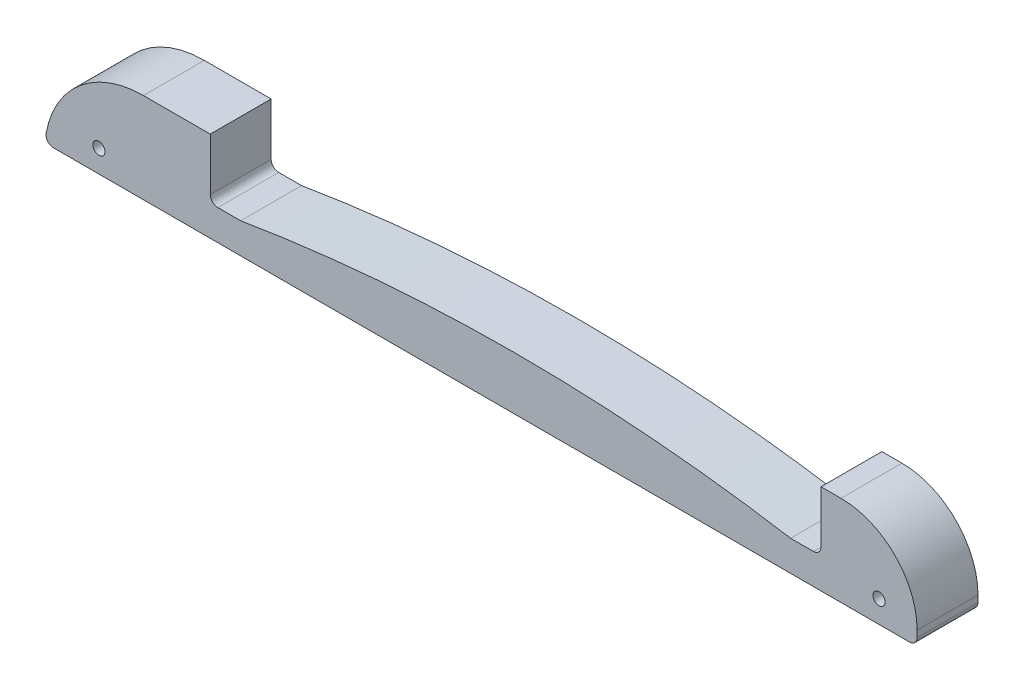
ISO-10303-21;
HEADER;
FILE_DESCRIPTION(('STEP AP214'),'2;1');
FILE_NAME('part.step','',(''),(''),'','','');
FILE_SCHEMA(('AUTOMOTIVE_DESIGN { 1 0 10303 214 1 1 1 1 }'));
ENDSEC;
DATA;
#1=APPLICATION_CONTEXT('core data for automotive mechanical design processes');
#2=APPLICATION_PROTOCOL_DEFINITION('international standard','automotive_design',2000,#1);
#3=PRODUCT_CONTEXT('',#1,'mechanical');
#4=PRODUCT('Part','Part','',(#3));
#5=PRODUCT_RELATED_PRODUCT_CATEGORY('part','',(#4));
#6=PRODUCT_DEFINITION_FORMATION('','',#4);
#7=PRODUCT_DEFINITION_CONTEXT('part definition',#1,'design');
#8=PRODUCT_DEFINITION('design','',#6,#7);
#9=PRODUCT_DEFINITION_SHAPE('','',#8);
#10=(LENGTH_UNIT() NAMED_UNIT(*) SI_UNIT(.MILLI.,.METRE.));
#11=(NAMED_UNIT(*) PLANE_ANGLE_UNIT() SI_UNIT($,.RADIAN.));
#12=(NAMED_UNIT(*) SI_UNIT($,.STERADIAN.) SOLID_ANGLE_UNIT());
#13=UNCERTAINTY_MEASURE_WITH_UNIT(LENGTH_MEASURE(1.E-05),#10,'distance_accuracy_value','');
#14=(GEOMETRIC_REPRESENTATION_CONTEXT(3) GLOBAL_UNCERTAINTY_ASSIGNED_CONTEXT((#13)) GLOBAL_UNIT_ASSIGNED_CONTEXT((#10,
#11,#12)) REPRESENTATION_CONTEXT('',''));
#15=CARTESIAN_POINT('',(0.,0.,0.));
#16=DIRECTION('',(0.,0.,1.));
#17=DIRECTION('',(1.,0.,0.));
#18=AXIS2_PLACEMENT_3D('',#15,#16,#17);
#19=CARTESIAN_POINT('',(7.24999999999997,-213.013788444421,0.));
#20=DIRECTION('',(0.,0.,-1.));
#21=DIRECTION('',(-1.,0.,0.));
#22=AXIS2_PLACEMENT_3D('',#19,#20,#21);
#23=PLANE('',#22);
#24=CARTESIAN_POINT('',(55.,2.93,0.));
#25=DIRECTION('',(0.,0.,1.));
#26=DIRECTION('',(1.,0.,0.));
#27=AXIS2_PLACEMENT_3D('',#24,#25,#26);
#28=CIRCLE('',#27,0.800000000000002);
#29=CARTESIAN_POINT('',(55.8,2.93,0.));
#30=VERTEX_POINT('',#29);
#31=EDGE_CURVE('E509',#30,#30,#28,.T.);
#32=ORIENTED_EDGE('',*,*,#31,.F.);
#33=EDGE_LOOP('',(#32));
#34=FACE_BOUND('',#33,.T.);
#35=DIRECTION('',(1.,0.,0.));
#36=VECTOR('',#35,1.);
#37=CARTESIAN_POINT('',(-54.6,0.,0.));
#38=LINE('',#37,#36);
#39=CARTESIAN_POINT('',(-53.4577226748116,0.,0.));
#40=VERTEX_POINT('',#39);
#41=CARTESIAN_POINT('',(59.,0.,0.));
#42=VERTEX_POINT('',#41);
#43=EDGE_CURVE('E233',#40,#42,#38,.T.);
#44=ORIENTED_EDGE('',*,*,#43,.T.);
#45=CARTESIAN_POINT('',(59.,1.,0.));
#46=DIRECTION('',(0.,0.,-1.));
#47=DIRECTION('',(-1.,0.,0.));
#48=AXIS2_PLACEMENT_3D('',#45,#46,#47);
#49=CIRCLE('',#48,1.);
#50=CARTESIAN_POINT('',(60.,1.,0.));
#51=VERTEX_POINT('',#50);
#52=EDGE_CURVE('E273',#42,#51,#49,.F.);
#53=ORIENTED_EDGE('',*,*,#52,.T.);
#54=DIRECTION('',(0.,1.,0.));
#55=VECTOR('',#54,1.);
#56=CARTESIAN_POINT('',(60.,11.86,0.));
#57=LINE('',#56,#55);
#58=CARTESIAN_POINT('',(60.,1.86,0.));
#59=VERTEX_POINT('',#58);
#60=EDGE_CURVE('E202',#51,#59,#57,.T.);
#61=ORIENTED_EDGE('',*,*,#60,.T.);
#62=CARTESIAN_POINT('',(50.,1.86,0.));
#63=DIRECTION('',(0.,0.,-1.));
#64=DIRECTION('',(-1.,0.,0.));
#65=AXIS2_PLACEMENT_3D('',#62,#63,#64);
#66=CIRCLE('',#65,10.);
#67=CARTESIAN_POINT('',(50.,11.86,0.));
#68=VERTEX_POINT('',#67);
#69=EDGE_CURVE('E255',#59,#68,#66,.F.);
#70=ORIENTED_EDGE('',*,*,#69,.T.);
#71=DIRECTION('',(-1.,0.,0.));
#72=VECTOR('',#71,1.);
#73=CARTESIAN_POINT('',(60.,11.86,0.));
#74=LINE('',#73,#72);
#75=CARTESIAN_POINT('',(47.3749999999999,11.86,0.));
#76=VERTEX_POINT('',#75);
#77=EDGE_CURVE('E205',#68,#76,#74,.T.);
#78=ORIENTED_EDGE('',*,*,#77,.T.);
#79=DIRECTION('',(0.,-1.,0.));
#80=VECTOR('',#79,1.);
#81=CARTESIAN_POINT('',(47.3749999999999,11.86,0.));
#82=LINE('',#81,#80);
#83=CARTESIAN_POINT('',(47.3749999999999,5.,0.));
#84=VERTEX_POINT('',#83);
#85=EDGE_CURVE('E169',#76,#84,#82,.T.);
#86=ORIENTED_EDGE('',*,*,#85,.T.);
#87=CARTESIAN_POINT('',(46.3749999999999,5.,0.));
#88=DIRECTION('',(0.,0.,-1.));
#89=DIRECTION('',(-1.,0.,0.));
#90=AXIS2_PLACEMENT_3D('',#87,#88,#89);
#91=CIRCLE('',#90,1.);
#92=CARTESIAN_POINT('',(46.3749999999999,4.,0.));
#93=VERTEX_POINT('',#92);
#94=EDGE_CURVE('E301',#84,#93,#91,.T.);
#95=ORIENTED_EDGE('',*,*,#94,.T.);
#96=DIRECTION('',(-1.,0.,0.));
#97=VECTOR('',#96,1.);
#98=CARTESIAN_POINT('',(47.3749999999999,4.,0.));
#99=LINE('',#98,#97);
#100=CARTESIAN_POINT('',(43.3749999999999,4.,0.));
#101=VERTEX_POINT('',#100);
#102=EDGE_CURVE('E211',#93,#101,#99,.T.);
#103=ORIENTED_EDGE('',*,*,#102,.T.);
#104=CARTESIAN_POINT('',(7.24999999999997,-213.013788444421,0.));
#105=DIRECTION('',(0.,0.,1.));
#106=DIRECTION('',(-1.,0.,0.));
#107=AXIS2_PLACEMENT_3D('',#104,#105,#106);
#108=CIRCLE('',#107,220.);
#109=CARTESIAN_POINT('',(-28.8750000000001,3.99999999999998,0.));
#110=VERTEX_POINT('',#109);
#111=EDGE_CURVE('E214',#101,#110,#108,.T.);
#112=ORIENTED_EDGE('',*,*,#111,.T.);
#113=DIRECTION('',(-1.,0.,0.));
#114=VECTOR('',#113,1.);
#115=CARTESIAN_POINT('',(-32.8750000000001,3.99999999999998,0.));
#116=LINE('',#115,#114);
#117=CARTESIAN_POINT('',(-31.8750000000001,3.99999999999998,0.));
#118=VERTEX_POINT('',#117);
#119=EDGE_CURVE('E218',#110,#118,#116,.T.);
#120=ORIENTED_EDGE('',*,*,#119,.T.);
#121=CARTESIAN_POINT('',(-31.8750000000001,4.99999999999998,0.));
#122=DIRECTION('',(0.,0.,-1.));
#123=DIRECTION('',(-1.,0.,0.));
#124=AXIS2_PLACEMENT_3D('',#121,#122,#123);
#125=CIRCLE('',#124,1.);
#126=CARTESIAN_POINT('',(-32.8750000000001,4.99999999999998,0.));
#127=VERTEX_POINT('',#126);
#128=EDGE_CURVE('E50',#118,#127,#125,.T.);
#129=ORIENTED_EDGE('',*,*,#128,.T.);
#130=DIRECTION('',(0.,1.,0.));
#131=VECTOR('',#130,1.);
#132=CARTESIAN_POINT('',(-32.8750000000001,3.99999999999998,0.));
#133=LINE('',#132,#131);
#134=CARTESIAN_POINT('',(-32.8750000000001,11.86,0.));
#135=VERTEX_POINT('',#134);
#136=EDGE_CURVE('E222',#127,#135,#133,.T.);
#137=ORIENTED_EDGE('',*,*,#136,.T.);
#138=DIRECTION('',(-1.,0.,0.));
#139=VECTOR('',#138,1.);
#140=CARTESIAN_POINT('',(-41.6500810813349,11.86,0.));
#141=LINE('',#140,#139);
#142=CARTESIAN_POINT('',(-41.6500810813349,11.86,0.));
#143=VERTEX_POINT('',#142);
#144=EDGE_CURVE('E225',#135,#143,#141,.T.);
#145=ORIENTED_EDGE('',*,*,#144,.T.);
#146=CARTESIAN_POINT('',(-41.6500810813349,-1.14,0.));
#147=DIRECTION('',(0.,0.,1.));
#148=DIRECTION('',(1.,0.,0.));
#149=AXIS2_PLACEMENT_3D('',#146,#147,#148);
#150=CIRCLE('',#149,13.);
#151=CARTESIAN_POINT('',(-54.4416928076013,1.17833333333333,0.));
#152=VERTEX_POINT('',#151);
#153=EDGE_CURVE('E229',#143,#152,#150,.T.);
#154=ORIENTED_EDGE('',*,*,#153,.T.);
#155=CARTESIAN_POINT('',(-53.4577226748116,1.,0.));
#156=DIRECTION('',(0.,0.,-1.));
#157=DIRECTION('',(-1.,0.,0.));
#158=AXIS2_PLACEMENT_3D('',#155,#156,#157);
#159=CIRCLE('',#158,1.);
#160=EDGE_CURVE('E270',#152,#40,#159,.F.);
#161=ORIENTED_EDGE('',*,*,#160,.T.);
#162=EDGE_LOOP('',(#44,#53,#61,#70,#78,#86,#95,#103,#112,#120,#129,#137,#145,#154,#161));
#163=FACE_BOUND('',#162,.T.);
#164=CARTESIAN_POINT('',(-47.5,2.93,0.));
#165=DIRECTION('',(0.,0.,1.));
#166=DIRECTION('',(1.,0.,0.));
#167=AXIS2_PLACEMENT_3D('',#164,#165,#166);
#168=CIRCLE('',#167,0.800000000000002);
#169=CARTESIAN_POINT('',(-46.7,2.93,0.));
#170=VERTEX_POINT('',#169);
#171=EDGE_CURVE('E505',#170,#170,#168,.T.);
#172=ORIENTED_EDGE('',*,*,#171,.F.);
#173=EDGE_LOOP('',(#172));
#174=FACE_BOUND('',#173,.T.);
#175=ADVANCED_FACE('F41',(#34,#163,#174),#23,.F.);
#176=CARTESIAN_POINT('',(7.24999999999997,-213.013788444421,-8.));
#177=DIRECTION('',(0.,0.,-1.));
#178=DIRECTION('',(-1.,0.,0.));
#179=AXIS2_PLACEMENT_3D('',#176,#177,#178);
#180=PLANE('',#179);
#181=CARTESIAN_POINT('',(55.,2.93,-8.));
#182=DIRECTION('',(0.,0.,1.));
#183=DIRECTION('',(1.,0.,0.));
#184=AXIS2_PLACEMENT_3D('',#181,#182,#183);
#185=CIRCLE('',#184,0.799999999999995);
#186=CARTESIAN_POINT('',(55.8,2.93,-8.));
#187=VERTEX_POINT('',#186);
#188=EDGE_CURVE('E206',#187,#187,#185,.T.);
#189=ORIENTED_EDGE('',*,*,#188,.T.);
#190=EDGE_LOOP('',(#189));
#191=FACE_BOUND('',#190,.T.);
#192=DIRECTION('',(0.,1.,0.));
#193=VECTOR('',#192,1.);
#194=CARTESIAN_POINT('',(60.,11.86,-8.));
#195=LINE('',#194,#193);
#196=CARTESIAN_POINT('',(60.,1.,-8.));
#197=VERTEX_POINT('',#196);
#198=CARTESIAN_POINT('',(60.,1.86,-8.));
#199=VERTEX_POINT('',#198);
#200=EDGE_CURVE('E162',#197,#199,#195,.T.);
#201=ORIENTED_EDGE('',*,*,#200,.F.);
#202=CARTESIAN_POINT('',(59.,1.,-8.));
#203=DIRECTION('',(0.,0.,-1.));
#204=DIRECTION('',(-1.,0.,0.));
#205=AXIS2_PLACEMENT_3D('',#202,#203,#204);
#206=CIRCLE('',#205,1.);
#207=CARTESIAN_POINT('',(59.,0.,-8.));
#208=VERTEX_POINT('',#207);
#209=EDGE_CURVE('E282',#197,#208,#206,.T.);
#210=ORIENTED_EDGE('',*,*,#209,.T.);
#211=DIRECTION('',(1.,0.,0.));
#212=VECTOR('',#211,1.);
#213=CARTESIAN_POINT('',(0.,0.,-8.));
#214=LINE('',#213,#212);
#215=CARTESIAN_POINT('',(-53.4577226748116,0.,-8.));
#216=VERTEX_POINT('',#215);
#217=EDGE_CURVE('E237',#216,#208,#214,.T.);
#218=ORIENTED_EDGE('',*,*,#217,.F.);
#219=CARTESIAN_POINT('',(-53.4577226748116,1.,-8.));
#220=DIRECTION('',(0.,0.,-1.));
#221=DIRECTION('',(-1.,0.,0.));
#222=AXIS2_PLACEMENT_3D('',#219,#220,#221);
#223=CIRCLE('',#222,1.);
#224=CARTESIAN_POINT('',(-54.4416928076013,1.17833333333333,-8.));
#225=VERTEX_POINT('',#224);
#226=EDGE_CURVE('E279',#216,#225,#223,.T.);
#227=ORIENTED_EDGE('',*,*,#226,.T.);
#228=CARTESIAN_POINT('',(-41.6500810813349,-1.14,-8.));
#229=DIRECTION('',(0.,0.,1.));
#230=DIRECTION('',(1.,0.,0.));
#231=AXIS2_PLACEMENT_3D('',#228,#229,#230);
#232=CIRCLE('',#231,13.);
#233=CARTESIAN_POINT('',(-41.6500810813349,11.86,-8.));
#234=VERTEX_POINT('',#233);
#235=EDGE_CURVE('E172',#234,#225,#232,.T.);
#236=ORIENTED_EDGE('',*,*,#235,.F.);
#237=DIRECTION('',(-1.,0.,0.));
#238=VECTOR('',#237,1.);
#239=CARTESIAN_POINT('',(-41.6500810813349,11.86,-8.));
#240=LINE('',#239,#238);
#241=CARTESIAN_POINT('',(-32.8750000000001,11.86,-8.));
#242=VERTEX_POINT('',#241);
#243=EDGE_CURVE('E195',#242,#234,#240,.T.);
#244=ORIENTED_EDGE('',*,*,#243,.F.);
#245=DIRECTION('',(0.,1.,0.));
#246=VECTOR('',#245,1.);
#247=CARTESIAN_POINT('',(-32.8750000000001,3.99999999999998,-8.));
#248=LINE('',#247,#246);
#249=CARTESIAN_POINT('',(-32.8750000000001,4.99999999999998,-8.));
#250=VERTEX_POINT('',#249);
#251=EDGE_CURVE('E192',#250,#242,#248,.T.);
#252=ORIENTED_EDGE('',*,*,#251,.F.);
#253=CARTESIAN_POINT('',(-31.8750000000001,4.99999999999998,-8.));
#254=DIRECTION('',(0.,0.,-1.));
#255=DIRECTION('',(-1.,0.,0.));
#256=AXIS2_PLACEMENT_3D('',#253,#254,#255);
#257=CIRCLE('',#256,1.);
#258=CARTESIAN_POINT('',(-31.8750000000001,3.99999999999998,-8.));
#259=VERTEX_POINT('',#258);
#260=EDGE_CURVE('E11',#250,#259,#257,.F.);
#261=ORIENTED_EDGE('',*,*,#260,.T.);
#262=DIRECTION('',(-1.,0.,0.));
#263=VECTOR('',#262,1.);
#264=CARTESIAN_POINT('',(-32.8750000000001,3.99999999999998,-8.));
#265=LINE('',#264,#263);
#266=CARTESIAN_POINT('',(-28.8750000000001,3.99999999999998,-8.));
#267=VERTEX_POINT('',#266);
#268=EDGE_CURVE('E188',#267,#259,#265,.T.);
#269=ORIENTED_EDGE('',*,*,#268,.F.);
#270=CARTESIAN_POINT('',(7.24999999999997,-213.013788444421,-8.));
#271=DIRECTION('',(0.,0.,1.));
#272=DIRECTION('',(-1.,0.,0.));
#273=AXIS2_PLACEMENT_3D('',#270,#271,#272);
#274=CIRCLE('',#273,220.);
#275=CARTESIAN_POINT('',(43.3749999999999,4.,-8.));
#276=VERTEX_POINT('',#275);
#277=EDGE_CURVE('E181',#276,#267,#274,.T.);
#278=ORIENTED_EDGE('',*,*,#277,.F.);
#279=DIRECTION('',(-1.,0.,0.));
#280=VECTOR('',#279,1.);
#281=CARTESIAN_POINT('',(47.3749999999999,4.,-8.));
#282=LINE('',#281,#280);
#283=CARTESIAN_POINT('',(46.3749999999999,4.,-8.));
#284=VERTEX_POINT('',#283);
#285=EDGE_CURVE('E178',#284,#276,#282,.T.);
#286=ORIENTED_EDGE('',*,*,#285,.F.);
#287=CARTESIAN_POINT('',(46.3749999999999,5.,-8.));
#288=DIRECTION('',(0.,0.,-1.));
#289=DIRECTION('',(-1.,0.,0.));
#290=AXIS2_PLACEMENT_3D('',#287,#288,#289);
#291=CIRCLE('',#290,1.);
#292=CARTESIAN_POINT('',(47.3749999999999,5.,-8.));
#293=VERTEX_POINT('',#292);
#294=EDGE_CURVE('E57',#284,#293,#291,.F.);
#295=ORIENTED_EDGE('',*,*,#294,.T.);
#296=DIRECTION('',(0.,-1.,0.));
#297=VECTOR('',#296,1.);
#298=CARTESIAN_POINT('',(47.3749999999999,11.86,-8.));
#299=LINE('',#298,#297);
#300=CARTESIAN_POINT('',(47.3749999999999,11.86,-8.));
#301=VERTEX_POINT('',#300);
#302=EDGE_CURVE('E161',#301,#293,#299,.T.);
#303=ORIENTED_EDGE('',*,*,#302,.F.);
#304=DIRECTION('',(-1.,0.,0.));
#305=VECTOR('',#304,1.);
#306=CARTESIAN_POINT('',(60.,11.86,-8.));
#307=LINE('',#306,#305);
#308=CARTESIAN_POINT('',(50.,11.86,-8.));
#309=VERTEX_POINT('',#308);
#310=EDGE_CURVE('E150',#309,#301,#307,.T.);
#311=ORIENTED_EDGE('',*,*,#310,.F.);
#312=CARTESIAN_POINT('',(50.,1.86,-8.));
#313=DIRECTION('',(0.,0.,-1.));
#314=DIRECTION('',(-1.,0.,0.));
#315=AXIS2_PLACEMENT_3D('',#312,#313,#314);
#316=CIRCLE('',#315,10.);
#317=EDGE_CURVE('E260',#309,#199,#316,.T.);
#318=ORIENTED_EDGE('',*,*,#317,.T.);
#319=EDGE_LOOP('',(#201,#210,#218,#227,#236,#244,#252,#261,#269,#278,#286,#295,#303,#311,#318));
#320=FACE_BOUND('',#319,.T.);
#321=CARTESIAN_POINT('',(-47.5,2.93,-8.));
#322=DIRECTION('',(0.,0.,1.));
#323=DIRECTION('',(1.,0.,0.));
#324=AXIS2_PLACEMENT_3D('',#321,#322,#323);
#325=CIRCLE('',#324,0.799999999999995);
#326=CARTESIAN_POINT('',(-46.7,2.93,-8.));
#327=VERTEX_POINT('',#326);
#328=EDGE_CURVE('E502',#327,#327,#325,.T.);
#329=ORIENTED_EDGE('',*,*,#328,.T.);
#330=EDGE_LOOP('',(#329));
#331=FACE_BOUND('',#330,.T.);
#332=ADVANCED_FACE('F175',(#191,#320,#331),#180,.T.);
#333=CARTESIAN_POINT('',(-54.6,0.,-8.));
#334=DIRECTION('',(0.,-1.,0.));
#335=DIRECTION('',(0.,0.,-1.));
#336=AXIS2_PLACEMENT_3D('',#333,#334,#335);
#337=PLANE('',#336);
#338=ORIENTED_EDGE('',*,*,#217,.T.);
#339=DIRECTION('',(0.,0.,1.));
#340=VECTOR('',#339,1.);
#341=CARTESIAN_POINT('',(59.,0.,-8.));
#342=LINE('',#341,#340);
#343=EDGE_CURVE('E266',#208,#42,#342,.T.);
#344=ORIENTED_EDGE('',*,*,#343,.T.);
#345=ORIENTED_EDGE('',*,*,#43,.F.);
#346=DIRECTION('',(0.,0.,1.));
#347=VECTOR('',#346,1.);
#348=CARTESIAN_POINT('',(-53.4577226748116,0.,-8.));
#349=LINE('',#348,#347);
#350=EDGE_CURVE('E263',#40,#216,#349,.F.);
#351=ORIENTED_EDGE('',*,*,#350,.T.);
#352=EDGE_LOOP('',(#338,#344,#345,#351));
#353=FACE_BOUND('',#352,.T.);
#354=ADVANCED_FACE('F345',(#353),#337,.T.);
#355=CARTESIAN_POINT('',(-41.6500810813349,-1.14,-8.));
#356=DIRECTION('',(0.,0.,1.));
#357=DIRECTION('',(1.,0.,0.));
#358=AXIS2_PLACEMENT_3D('',#355,#356,#357);
#359=CYLINDRICAL_SURFACE('',#358,13.);
#360=ORIENTED_EDGE('',*,*,#235,.T.);
#361=DIRECTION('',(0.,0.,1.));
#362=VECTOR('',#361,1.);
#363=CARTESIAN_POINT('',(-54.4416928076013,1.17833333333333,-8.));
#364=LINE('',#363,#362);
#365=EDGE_CURVE('E285',#225,#152,#364,.T.);
#366=ORIENTED_EDGE('',*,*,#365,.T.);
#367=ORIENTED_EDGE('',*,*,#153,.F.);
#368=DIRECTION('',(0.,0.,1.));
#369=VECTOR('',#368,1.);
#370=CARTESIAN_POINT('',(-41.6500810813349,11.86,-8.));
#371=LINE('',#370,#369);
#372=EDGE_CURVE('E238',#234,#143,#371,.T.);
#373=ORIENTED_EDGE('',*,*,#372,.F.);
#374=EDGE_LOOP('',(#360,#366,#367,#373));
#375=FACE_BOUND('',#374,.T.);
#376=ADVANCED_FACE('F354',(#375),#359,.T.);
#377=CARTESIAN_POINT('',(-41.6500810813349,11.86,-8.));
#378=DIRECTION('',(0.,1.,0.));
#379=DIRECTION('',(0.,0.,1.));
#380=AXIS2_PLACEMENT_3D('',#377,#378,#379);
#381=PLANE('',#380);
#382=ORIENTED_EDGE('',*,*,#144,.F.);
#383=DIRECTION('',(0.,0.,1.));
#384=VECTOR('',#383,1.);
#385=CARTESIAN_POINT('',(-32.8750000000001,11.86,-8.));
#386=LINE('',#385,#384);
#387=EDGE_CURVE('E242',#242,#135,#386,.T.);
#388=ORIENTED_EDGE('',*,*,#387,.F.);
#389=ORIENTED_EDGE('',*,*,#243,.T.);
#390=ORIENTED_EDGE('',*,*,#372,.T.);
#391=EDGE_LOOP('',(#382,#388,#389,#390));
#392=FACE_BOUND('',#391,.T.);
#393=ADVANCED_FACE('F357',(#392),#381,.T.);
#394=CARTESIAN_POINT('',(-32.8750000000001,3.99999999999998,-8.));
#395=DIRECTION('',(1.,0.,0.));
#396=DIRECTION('',(0.,0.,-1.));
#397=AXIS2_PLACEMENT_3D('',#394,#395,#396);
#398=PLANE('',#397);
#399=ORIENTED_EDGE('',*,*,#136,.F.);
#400=DIRECTION('',(0.,0.,1.));
#401=VECTOR('',#400,1.);
#402=CARTESIAN_POINT('',(-32.8750000000001,4.99999999999998,-8.));
#403=LINE('',#402,#401);
#404=EDGE_CURVE('E298',#127,#250,#403,.F.);
#405=ORIENTED_EDGE('',*,*,#404,.T.);
#406=ORIENTED_EDGE('',*,*,#251,.T.);
#407=ORIENTED_EDGE('',*,*,#387,.T.);
#408=EDGE_LOOP('',(#399,#405,#406,#407));
#409=FACE_BOUND('',#408,.T.);
#410=ADVANCED_FACE('F314',(#409),#398,.T.);
#411=CARTESIAN_POINT('',(-32.8750000000001,3.99999999999998,-8.));
#412=DIRECTION('',(0.,1.,0.));
#413=DIRECTION('',(-1.,0.,0.));
#414=AXIS2_PLACEMENT_3D('',#411,#412,#413);
#415=PLANE('',#414);
#416=ORIENTED_EDGE('',*,*,#268,.T.);
#417=DIRECTION('',(0.,0.,1.));
#418=VECTOR('',#417,1.);
#419=CARTESIAN_POINT('',(-31.8750000000001,3.99999999999998,0.));
#420=LINE('',#419,#418);
#421=EDGE_CURVE('E294',#259,#118,#420,.T.);
#422=ORIENTED_EDGE('',*,*,#421,.T.);
#423=ORIENTED_EDGE('',*,*,#119,.F.);
#424=DIRECTION('',(0.,0.,1.));
#425=VECTOR('',#424,1.);
#426=CARTESIAN_POINT('',(-28.8750000000001,3.99999999999998,-8.));
#427=LINE('',#426,#425);
#428=EDGE_CURVE('E246',#267,#110,#427,.T.);
#429=ORIENTED_EDGE('',*,*,#428,.F.);
#430=EDGE_LOOP('',(#416,#422,#423,#429));
#431=FACE_BOUND('',#430,.T.);
#432=ADVANCED_FACE('F323',(#431),#415,.T.);
#433=CARTESIAN_POINT('',(7.24999999999997,-213.013788444421,-8.));
#434=DIRECTION('',(0.,0.,1.));
#435=DIRECTION('',(1.,0.,0.));
#436=AXIS2_PLACEMENT_3D('',#433,#434,#435);
#437=CYLINDRICAL_SURFACE('',#436,220.);
#438=ORIENTED_EDGE('',*,*,#111,.F.);
#439=DIRECTION('',(0.,0.,1.));
#440=VECTOR('',#439,1.);
#441=CARTESIAN_POINT('',(43.3749999999999,4.,-8.));
#442=LINE('',#441,#440);
#443=EDGE_CURVE('E171',#276,#101,#442,.T.);
#444=ORIENTED_EDGE('',*,*,#443,.F.);
#445=ORIENTED_EDGE('',*,*,#277,.T.);
#446=ORIENTED_EDGE('',*,*,#428,.T.);
#447=EDGE_LOOP('',(#438,#444,#445,#446));
#448=FACE_BOUND('',#447,.T.);
#449=ADVANCED_FACE('F326',(#448),#437,.T.);
#450=CARTESIAN_POINT('',(47.3749999999999,4.,-8.));
#451=DIRECTION('',(0.,1.,0.));
#452=DIRECTION('',(0.,0.,1.));
#453=AXIS2_PLACEMENT_3D('',#450,#451,#452);
#454=PLANE('',#453);
#455=ORIENTED_EDGE('',*,*,#102,.F.);
#456=DIRECTION('',(0.,0.,1.));
#457=VECTOR('',#456,1.);
#458=CARTESIAN_POINT('',(46.3749999999999,4.,-8.));
#459=LINE('',#458,#457);
#460=EDGE_CURVE('E65',#93,#284,#459,.F.);
#461=ORIENTED_EDGE('',*,*,#460,.T.);
#462=ORIENTED_EDGE('',*,*,#285,.T.);
#463=ORIENTED_EDGE('',*,*,#443,.T.);
#464=EDGE_LOOP('',(#455,#461,#462,#463));
#465=FACE_BOUND('',#464,.T.);
#466=ADVANCED_FACE('F409',(#465),#454,.T.);
#467=CARTESIAN_POINT('',(47.3749999999999,11.86,-8.));
#468=DIRECTION('',(-1.,0.,0.));
#469=DIRECTION('',(0.,-1.,0.));
#470=AXIS2_PLACEMENT_3D('',#467,#468,#469);
#471=PLANE('',#470);
#472=ORIENTED_EDGE('',*,*,#302,.T.);
#473=DIRECTION('',(0.,0.,1.));
#474=VECTOR('',#473,1.);
#475=CARTESIAN_POINT('',(47.3749999999999,5.,0.));
#476=LINE('',#475,#474);
#477=EDGE_CURVE('E289',#293,#84,#476,.T.);
#478=ORIENTED_EDGE('',*,*,#477,.T.);
#479=ORIENTED_EDGE('',*,*,#85,.F.);
#480=DIRECTION('',(0.,0.,1.));
#481=VECTOR('',#480,1.);
#482=CARTESIAN_POINT('',(47.3749999999999,11.86,-8.));
#483=LINE('',#482,#481);
#484=EDGE_CURVE('E154',#301,#76,#483,.T.);
#485=ORIENTED_EDGE('',*,*,#484,.F.);
#486=EDGE_LOOP('',(#472,#478,#479,#485));
#487=FACE_BOUND('',#486,.T.);
#488=ADVANCED_FACE('F165',(#487),#471,.T.);
#489=CARTESIAN_POINT('',(60.,11.86,-8.));
#490=DIRECTION('',(0.,1.,0.));
#491=DIRECTION('',(-1.,0.,0.));
#492=AXIS2_PLACEMENT_3D('',#489,#490,#491);
#493=PLANE('',#492);
#494=ORIENTED_EDGE('',*,*,#77,.F.);
#495=DIRECTION('',(0.,0.,1.));
#496=VECTOR('',#495,1.);
#497=CARTESIAN_POINT('',(50.,11.86,-8.));
#498=LINE('',#497,#496);
#499=EDGE_CURVE('E157',#68,#309,#498,.F.);
#500=ORIENTED_EDGE('',*,*,#499,.T.);
#501=ORIENTED_EDGE('',*,*,#310,.T.);
#502=ORIENTED_EDGE('',*,*,#484,.T.);
#503=EDGE_LOOP('',(#494,#500,#501,#502));
#504=FACE_BOUND('',#503,.T.);
#505=ADVANCED_FACE('F153',(#504),#493,.T.);
#506=CARTESIAN_POINT('',(60.,11.86,-8.));
#507=DIRECTION('',(1.,0.,0.));
#508=DIRECTION('',(0.,0.,-1.));
#509=AXIS2_PLACEMENT_3D('',#506,#507,#508);
#510=PLANE('',#509);
#511=ORIENTED_EDGE('',*,*,#60,.F.);
#512=DIRECTION('',(0.,0.,1.));
#513=VECTOR('',#512,1.);
#514=CARTESIAN_POINT('',(60.,1.,-8.));
#515=LINE('',#514,#513);
#516=EDGE_CURVE('E276',#51,#197,#515,.F.);
#517=ORIENTED_EDGE('',*,*,#516,.T.);
#518=ORIENTED_EDGE('',*,*,#200,.T.);
#519=DIRECTION('',(0.,0.,1.));
#520=VECTOR('',#519,1.);
#521=CARTESIAN_POINT('',(60.,1.86,-8.));
#522=LINE('',#521,#520);
#523=EDGE_CURVE('E241',#199,#59,#522,.T.);
#524=ORIENTED_EDGE('',*,*,#523,.T.);
#525=EDGE_LOOP('',(#511,#517,#518,#524));
#526=FACE_BOUND('',#525,.T.);
#527=ADVANCED_FACE('F428',(#526),#510,.T.);
#528=CARTESIAN_POINT('',(50.,1.86,-8.));
#529=DIRECTION('',(0.,0.,1.));
#530=DIRECTION('',(1.,0.,0.));
#531=AXIS2_PLACEMENT_3D('',#528,#529,#530);
#532=CYLINDRICAL_SURFACE('',#531,10.);
#533=ORIENTED_EDGE('',*,*,#317,.F.);
#534=ORIENTED_EDGE('',*,*,#499,.F.);
#535=ORIENTED_EDGE('',*,*,#69,.F.);
#536=ORIENTED_EDGE('',*,*,#523,.F.);
#537=EDGE_LOOP('',(#533,#534,#535,#536));
#538=FACE_BOUND('',#537,.T.);
#539=ADVANCED_FACE('F332',(#538),#532,.T.);
#540=CARTESIAN_POINT('',(59.,1.,-8.));
#541=DIRECTION('',(0.,0.,1.));
#542=DIRECTION('',(1.,0.,0.));
#543=AXIS2_PLACEMENT_3D('',#540,#541,#542);
#544=CYLINDRICAL_SURFACE('',#543,1.);
#545=ORIENTED_EDGE('',*,*,#209,.F.);
#546=ORIENTED_EDGE('',*,*,#516,.F.);
#547=ORIENTED_EDGE('',*,*,#52,.F.);
#548=ORIENTED_EDGE('',*,*,#343,.F.);
#549=EDGE_LOOP('',(#545,#546,#547,#548));
#550=FACE_BOUND('',#549,.T.);
#551=ADVANCED_FACE('F342',(#550),#544,.T.);
#552=CARTESIAN_POINT('',(-53.4577226748116,1.,-8.));
#553=DIRECTION('',(0.,0.,1.));
#554=DIRECTION('',(1.,0.,0.));
#555=AXIS2_PLACEMENT_3D('',#552,#553,#554);
#556=CYLINDRICAL_SURFACE('',#555,1.);
#557=ORIENTED_EDGE('',*,*,#226,.F.);
#558=ORIENTED_EDGE('',*,*,#350,.F.);
#559=ORIENTED_EDGE('',*,*,#160,.F.);
#560=ORIENTED_EDGE('',*,*,#365,.F.);
#561=EDGE_LOOP('',(#557,#558,#559,#560));
#562=FACE_BOUND('',#561,.T.);
#563=ADVANCED_FACE('F352',(#562),#556,.T.);
#564=CARTESIAN_POINT('',(46.3749999999999,5.,-8.));
#565=DIRECTION('',(0.,0.,-1.));
#566=DIRECTION('',(-1.,0.,0.));
#567=AXIS2_PLACEMENT_3D('',#564,#565,#566);
#568=CYLINDRICAL_SURFACE('',#567,1.);
#569=ORIENTED_EDGE('',*,*,#294,.F.);
#570=ORIENTED_EDGE('',*,*,#460,.F.);
#571=ORIENTED_EDGE('',*,*,#94,.F.);
#572=ORIENTED_EDGE('',*,*,#477,.F.);
#573=EDGE_LOOP('',(#569,#570,#571,#572));
#574=FACE_BOUND('',#573,.T.);
#575=ADVANCED_FACE('F329',(#574),#568,.F.);
#576=CARTESIAN_POINT('',(-31.8750000000001,4.99999999999998,-8.));
#577=DIRECTION('',(0.,0.,-1.));
#578=DIRECTION('',(-1.,0.,0.));
#579=AXIS2_PLACEMENT_3D('',#576,#577,#578);
#580=CYLINDRICAL_SURFACE('',#579,1.);
#581=ORIENTED_EDGE('',*,*,#260,.F.);
#582=ORIENTED_EDGE('',*,*,#404,.F.);
#583=ORIENTED_EDGE('',*,*,#128,.F.);
#584=ORIENTED_EDGE('',*,*,#421,.F.);
#585=EDGE_LOOP('',(#581,#582,#583,#584));
#586=FACE_BOUND('',#585,.T.);
#587=ADVANCED_FACE('F43',(#586),#580,.F.);
#588=CARTESIAN_POINT('',(55.,2.93,0.));
#589=DIRECTION('',(0.,0.,1.));
#590=DIRECTION('',(1.,0.,0.));
#591=AXIS2_PLACEMENT_3D('',#588,#589,#590);
#592=CYLINDRICAL_SURFACE('',#591,0.799999999999999);
#593=ORIENTED_EDGE('',*,*,#188,.F.);
#594=EDGE_LOOP('',(#593));
#595=FACE_BOUND('',#594,.T.);
#596=ORIENTED_EDGE('',*,*,#31,.T.);
#597=EDGE_LOOP('',(#596));
#598=FACE_BOUND('',#597,.T.);
#599=ADVANCED_FACE('F465',(#595,#598),#592,.F.);
#600=CARTESIAN_POINT('',(-47.5,2.93,0.));
#601=DIRECTION('',(0.,0.,1.));
#602=DIRECTION('',(1.,0.,0.));
#603=AXIS2_PLACEMENT_3D('',#600,#601,#602);
#604=CYLINDRICAL_SURFACE('',#603,0.799999999999999);
#605=ORIENTED_EDGE('',*,*,#328,.F.);
#606=EDGE_LOOP('',(#605));
#607=FACE_BOUND('',#606,.T.);
#608=ORIENTED_EDGE('',*,*,#171,.T.);
#609=EDGE_LOOP('',(#608));
#610=FACE_BOUND('',#609,.T.);
#611=ADVANCED_FACE('F483',(#607,#610),#604,.F.);
#612=CLOSED_SHELL('',(#175,#332,#354,#376,#393,#410,#432,#449,#466,#488,#505,#527,#539,#551,
#563,#575,#587,#599,#611));
#613=MANIFOLD_SOLID_BREP('B2',#612);
#614=ADVANCED_BREP_SHAPE_REPRESENTATION('',(#18,#613),#14);
#615=SHAPE_DEFINITION_REPRESENTATION(#9,#614);
ENDSEC;
END-ISO-10303-21;
